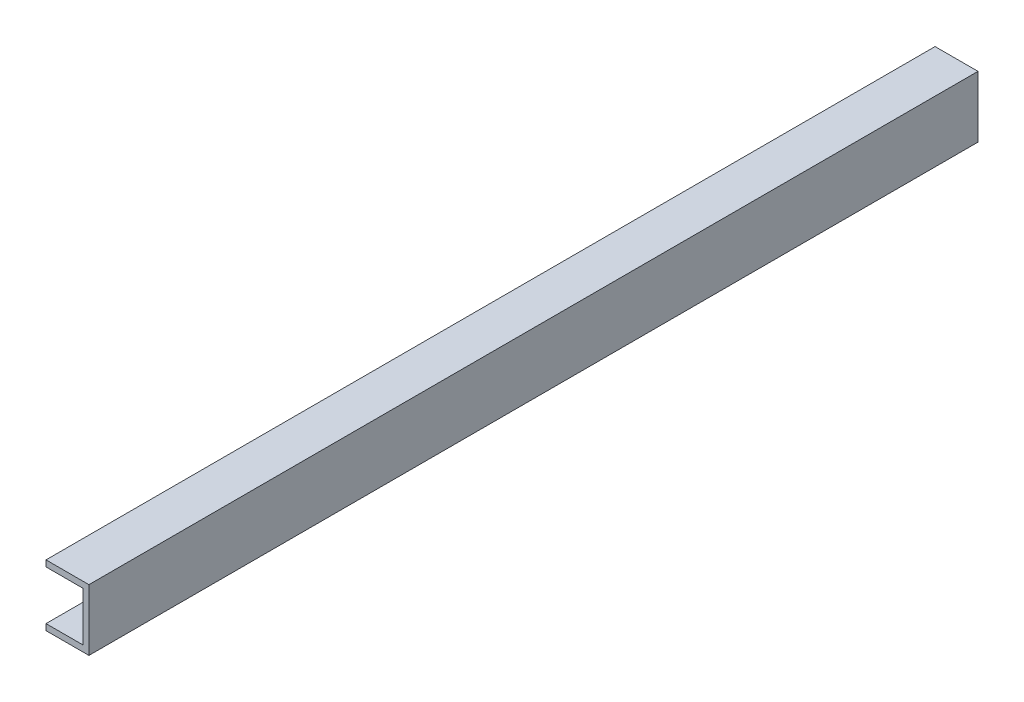
ISO-10303-21;
HEADER;
FILE_DESCRIPTION(('STEP AP214'),'2;1');
FILE_NAME('part.step','',(''),(''),'','','');
FILE_SCHEMA(('AUTOMOTIVE_DESIGN { 1 0 10303 214 1 1 1 1 }'));
ENDSEC;
DATA;
#1=APPLICATION_CONTEXT('core data for automotive mechanical design processes');
#2=APPLICATION_PROTOCOL_DEFINITION('international standard','automotive_design',2000,#1);
#3=PRODUCT_CONTEXT('',#1,'mechanical');
#4=PRODUCT('Part','Part','',(#3));
#5=PRODUCT_RELATED_PRODUCT_CATEGORY('part','',(#4));
#6=PRODUCT_DEFINITION_FORMATION('','',#4);
#7=PRODUCT_DEFINITION_CONTEXT('part definition',#1,'design');
#8=PRODUCT_DEFINITION('design','',#6,#7);
#9=PRODUCT_DEFINITION_SHAPE('','',#8);
#10=(LENGTH_UNIT() NAMED_UNIT(*) SI_UNIT(.MILLI.,.METRE.));
#11=(NAMED_UNIT(*) PLANE_ANGLE_UNIT() SI_UNIT($,.RADIAN.));
#12=(NAMED_UNIT(*) SI_UNIT($,.STERADIAN.) SOLID_ANGLE_UNIT());
#13=UNCERTAINTY_MEASURE_WITH_UNIT(LENGTH_MEASURE(1.E-05),#10,'distance_accuracy_value','');
#14=(GEOMETRIC_REPRESENTATION_CONTEXT(3) GLOBAL_UNCERTAINTY_ASSIGNED_CONTEXT((#13)) GLOBAL_UNIT_ASSIGNED_CONTEXT((#10,
#11,#12)) REPRESENTATION_CONTEXT('',''));
#15=CARTESIAN_POINT('',(0.,0.,0.));
#16=DIRECTION('',(0.,0.,1.));
#17=DIRECTION('',(1.,0.,0.));
#18=AXIS2_PLACEMENT_3D('',#15,#16,#17);
#19=CARTESIAN_POINT('',(0.,2.,290.));
#20=DIRECTION('',(1.,0.,0.));
#21=DIRECTION('',(0.,0.,-1.));
#22=AXIS2_PLACEMENT_3D('',#19,#20,#21);
#23=PLANE('',#22);
#24=DIRECTION('',(0.,-1.,0.));
#25=VECTOR('',#24,1.);
#26=CARTESIAN_POINT('',(0.,2.,0.));
#27=LINE('',#26,#25);
#28=CARTESIAN_POINT('',(0.,2.,0.));
#29=VERTEX_POINT('',#28);
#30=CARTESIAN_POINT('',(0.,0.,0.));
#31=VERTEX_POINT('',#30);
#32=EDGE_CURVE('E128',#29,#31,#27,.T.);
#33=ORIENTED_EDGE('',*,*,#32,.T.);
#34=DIRECTION('',(0.,0.,-1.));
#35=VECTOR('',#34,1.);
#36=CARTESIAN_POINT('',(0.,0.,290.));
#37=LINE('',#36,#35);
#38=CARTESIAN_POINT('',(0.,0.,290.));
#39=VERTEX_POINT('',#38);
#40=EDGE_CURVE('E11',#39,#31,#37,.T.);
#41=ORIENTED_EDGE('',*,*,#40,.F.);
#42=DIRECTION('',(0.,-1.,0.));
#43=VECTOR('',#42,1.);
#44=CARTESIAN_POINT('',(0.,2.,290.));
#45=LINE('',#44,#43);
#46=CARTESIAN_POINT('',(0.,2.,290.));
#47=VERTEX_POINT('',#46);
#48=EDGE_CURVE('E142',#47,#39,#45,.T.);
#49=ORIENTED_EDGE('',*,*,#48,.F.);
#50=DIRECTION('',(0.,0.,-1.));
#51=VECTOR('',#50,1.);
#52=CARTESIAN_POINT('',(0.,2.,290.));
#53=LINE('',#52,#51);
#54=EDGE_CURVE('E124',#47,#29,#53,.T.);
#55=ORIENTED_EDGE('',*,*,#54,.T.);
#56=EDGE_LOOP('',(#33,#41,#49,#55));
#57=FACE_BOUND('',#56,.T.);
#58=ADVANCED_FACE('F32',(#57),#23,.F.);
#59=CARTESIAN_POINT('',(0.,0.,290.));
#60=DIRECTION('',(0.,1.,0.));
#61=DIRECTION('',(0.,0.,1.));
#62=AXIS2_PLACEMENT_3D('',#59,#60,#61);
#63=PLANE('',#62);
#64=DIRECTION('',(1.,0.,0.));
#65=VECTOR('',#64,1.);
#66=CARTESIAN_POINT('',(0.,0.,0.));
#67=LINE('',#66,#65);
#68=CARTESIAN_POINT('',(14.,0.,0.));
#69=VERTEX_POINT('',#68);
#70=EDGE_CURVE('E131',#31,#69,#67,.T.);
#71=ORIENTED_EDGE('',*,*,#70,.T.);
#72=DIRECTION('',(0.,0.,-1.));
#73=VECTOR('',#72,1.);
#74=CARTESIAN_POINT('',(14.,0.,290.));
#75=LINE('',#74,#73);
#76=CARTESIAN_POINT('',(14.,0.,290.));
#77=VERTEX_POINT('',#76);
#78=EDGE_CURVE('E40',#77,#69,#75,.T.);
#79=ORIENTED_EDGE('',*,*,#78,.F.);
#80=DIRECTION('',(1.,0.,0.));
#81=VECTOR('',#80,1.);
#82=CARTESIAN_POINT('',(0.,0.,290.));
#83=LINE('',#82,#81);
#84=EDGE_CURVE('E91',#39,#77,#83,.T.);
#85=ORIENTED_EDGE('',*,*,#84,.F.);
#86=ORIENTED_EDGE('',*,*,#40,.T.);
#87=EDGE_LOOP('',(#71,#79,#85,#86));
#88=FACE_BOUND('',#87,.T.);
#89=ADVANCED_FACE('F177',(#88),#63,.F.);
#90=CARTESIAN_POINT('',(14.,0.,290.));
#91=DIRECTION('',(-1.,0.,0.));
#92=DIRECTION('',(0.,0.,1.));
#93=AXIS2_PLACEMENT_3D('',#90,#91,#92);
#94=PLANE('',#93);
#95=DIRECTION('',(0.,1.,0.));
#96=VECTOR('',#95,1.);
#97=CARTESIAN_POINT('',(14.,0.,0.));
#98=LINE('',#97,#96);
#99=CARTESIAN_POINT('',(14.,20.,0.));
#100=VERTEX_POINT('',#99);
#101=EDGE_CURVE('E133',#69,#100,#98,.T.);
#102=ORIENTED_EDGE('',*,*,#101,.T.);
#103=DIRECTION('',(0.,0.,-1.));
#104=VECTOR('',#103,1.);
#105=CARTESIAN_POINT('',(14.,20.,290.));
#106=LINE('',#105,#104);
#107=CARTESIAN_POINT('',(14.,20.,290.));
#108=VERTEX_POINT('',#107);
#109=EDGE_CURVE('E149',#108,#100,#106,.T.);
#110=ORIENTED_EDGE('',*,*,#109,.F.);
#111=DIRECTION('',(0.,1.,0.));
#112=VECTOR('',#111,1.);
#113=CARTESIAN_POINT('',(14.,0.,290.));
#114=LINE('',#113,#112);
#115=EDGE_CURVE('E157',#77,#108,#114,.T.);
#116=ORIENTED_EDGE('',*,*,#115,.F.);
#117=ORIENTED_EDGE('',*,*,#78,.T.);
#118=EDGE_LOOP('',(#102,#110,#116,#117));
#119=FACE_BOUND('',#118,.T.);
#120=ADVANCED_FACE('F155',(#119),#94,.F.);
#121=CARTESIAN_POINT('',(14.,20.,290.));
#122=DIRECTION('',(0.,-1.,0.));
#123=DIRECTION('',(0.,0.,-1.));
#124=AXIS2_PLACEMENT_3D('',#121,#122,#123);
#125=PLANE('',#124);
#126=DIRECTION('',(-1.,0.,0.));
#127=VECTOR('',#126,1.);
#128=CARTESIAN_POINT('',(14.,20.,0.));
#129=LINE('',#128,#127);
#130=CARTESIAN_POINT('',(0.,20.,0.));
#131=VERTEX_POINT('',#130);
#132=EDGE_CURVE('E135',#100,#131,#129,.T.);
#133=ORIENTED_EDGE('',*,*,#132,.T.);
#134=DIRECTION('',(0.,0.,-1.));
#135=VECTOR('',#134,1.);
#136=CARTESIAN_POINT('',(0.,20.,290.));
#137=LINE('',#136,#135);
#138=CARTESIAN_POINT('',(0.,20.,290.));
#139=VERTEX_POINT('',#138);
#140=EDGE_CURVE('E146',#139,#131,#137,.T.);
#141=ORIENTED_EDGE('',*,*,#140,.F.);
#142=DIRECTION('',(-1.,0.,0.));
#143=VECTOR('',#142,1.);
#144=CARTESIAN_POINT('',(14.,20.,290.));
#145=LINE('',#144,#143);
#146=EDGE_CURVE('E169',#108,#139,#145,.T.);
#147=ORIENTED_EDGE('',*,*,#146,.F.);
#148=ORIENTED_EDGE('',*,*,#109,.T.);
#149=EDGE_LOOP('',(#133,#141,#147,#148));
#150=FACE_BOUND('',#149,.T.);
#151=ADVANCED_FACE('F165',(#150),#125,.F.);
#152=CARTESIAN_POINT('',(0.,20.,290.));
#153=DIRECTION('',(1.,0.,0.));
#154=DIRECTION('',(0.,1.,0.));
#155=AXIS2_PLACEMENT_3D('',#152,#153,#154);
#156=PLANE('',#155);
#157=DIRECTION('',(0.,-1.,0.));
#158=VECTOR('',#157,1.);
#159=CARTESIAN_POINT('',(0.,20.,0.));
#160=LINE('',#159,#158);
#161=CARTESIAN_POINT('',(0.,18.,0.));
#162=VERTEX_POINT('',#161);
#163=EDGE_CURVE('E137',#131,#162,#160,.T.);
#164=ORIENTED_EDGE('',*,*,#163,.T.);
#165=DIRECTION('',(0.,0.,-1.));
#166=VECTOR('',#165,1.);
#167=CARTESIAN_POINT('',(0.,18.,290.));
#168=LINE('',#167,#166);
#169=CARTESIAN_POINT('',(0.,18.,290.));
#170=VERTEX_POINT('',#169);
#171=EDGE_CURVE('E119',#170,#162,#168,.T.);
#172=ORIENTED_EDGE('',*,*,#171,.F.);
#173=DIRECTION('',(0.,-1.,0.));
#174=VECTOR('',#173,1.);
#175=CARTESIAN_POINT('',(0.,20.,290.));
#176=LINE('',#175,#174);
#177=EDGE_CURVE('E110',#139,#170,#176,.T.);
#178=ORIENTED_EDGE('',*,*,#177,.F.);
#179=ORIENTED_EDGE('',*,*,#140,.T.);
#180=EDGE_LOOP('',(#164,#172,#178,#179));
#181=FACE_BOUND('',#180,.T.);
#182=ADVANCED_FACE('F168',(#181),#156,.F.);
#183=CARTESIAN_POINT('',(0.,18.,290.));
#184=DIRECTION('',(0.,1.,0.));
#185=DIRECTION('',(0.,0.,1.));
#186=AXIS2_PLACEMENT_3D('',#183,#184,#185);
#187=PLANE('',#186);
#188=DIRECTION('',(1.,0.,0.));
#189=VECTOR('',#188,1.);
#190=CARTESIAN_POINT('',(0.,18.,0.));
#191=LINE('',#190,#189);
#192=CARTESIAN_POINT('',(12.,18.,0.));
#193=VERTEX_POINT('',#192);
#194=EDGE_CURVE('E118',#162,#193,#191,.T.);
#195=ORIENTED_EDGE('',*,*,#194,.T.);
#196=DIRECTION('',(0.,0.,-1.));
#197=VECTOR('',#196,1.);
#198=CARTESIAN_POINT('',(12.,18.,290.));
#199=LINE('',#198,#197);
#200=CARTESIAN_POINT('',(12.,18.,290.));
#201=VERTEX_POINT('',#200);
#202=EDGE_CURVE('E115',#201,#193,#199,.T.);
#203=ORIENTED_EDGE('',*,*,#202,.F.);
#204=DIRECTION('',(1.,0.,0.));
#205=VECTOR('',#204,1.);
#206=CARTESIAN_POINT('',(0.,18.,290.));
#207=LINE('',#206,#205);
#208=EDGE_CURVE('E104',#170,#201,#207,.T.);
#209=ORIENTED_EDGE('',*,*,#208,.F.);
#210=ORIENTED_EDGE('',*,*,#171,.T.);
#211=EDGE_LOOP('',(#195,#203,#209,#210));
#212=FACE_BOUND('',#211,.T.);
#213=ADVANCED_FACE('F116',(#212),#187,.F.);
#214=CARTESIAN_POINT('',(12.,18.,290.));
#215=DIRECTION('',(1.,0.,0.));
#216=DIRECTION('',(0.,1.,0.));
#217=AXIS2_PLACEMENT_3D('',#214,#215,#216);
#218=PLANE('',#217);
#219=DIRECTION('',(0.,-1.,0.));
#220=VECTOR('',#219,1.);
#221=CARTESIAN_POINT('',(12.,18.,0.));
#222=LINE('',#221,#220);
#223=CARTESIAN_POINT('',(12.,2.,0.));
#224=VERTEX_POINT('',#223);
#225=EDGE_CURVE('E77',#193,#224,#222,.T.);
#226=ORIENTED_EDGE('',*,*,#225,.T.);
#227=DIRECTION('',(0.,0.,-1.));
#228=VECTOR('',#227,1.);
#229=CARTESIAN_POINT('',(12.,2.,290.));
#230=LINE('',#229,#228);
#231=CARTESIAN_POINT('',(12.,2.,290.));
#232=VERTEX_POINT('',#231);
#233=EDGE_CURVE('E120',#232,#224,#230,.T.);
#234=ORIENTED_EDGE('',*,*,#233,.F.);
#235=DIRECTION('',(0.,-1.,0.));
#236=VECTOR('',#235,1.);
#237=CARTESIAN_POINT('',(12.,18.,290.));
#238=LINE('',#237,#236);
#239=EDGE_CURVE('E108',#201,#232,#238,.T.);
#240=ORIENTED_EDGE('',*,*,#239,.F.);
#241=ORIENTED_EDGE('',*,*,#202,.T.);
#242=EDGE_LOOP('',(#226,#234,#240,#241));
#243=FACE_BOUND('',#242,.T.);
#244=ADVANCED_FACE('F122',(#243),#218,.F.);
#245=CARTESIAN_POINT('',(12.,2.,290.));
#246=DIRECTION('',(0.,-1.,0.));
#247=DIRECTION('',(0.,0.,-1.));
#248=AXIS2_PLACEMENT_3D('',#245,#246,#247);
#249=PLANE('',#248);
#250=DIRECTION('',(-1.,0.,0.));
#251=VECTOR('',#250,1.);
#252=CARTESIAN_POINT('',(12.,2.,0.));
#253=LINE('',#252,#251);
#254=EDGE_CURVE('E83',#224,#29,#253,.T.);
#255=ORIENTED_EDGE('',*,*,#254,.T.);
#256=ORIENTED_EDGE('',*,*,#54,.F.);
#257=DIRECTION('',(-1.,0.,0.));
#258=VECTOR('',#257,1.);
#259=CARTESIAN_POINT('',(12.,2.,290.));
#260=LINE('',#259,#258);
#261=EDGE_CURVE('E48',#232,#47,#260,.T.);
#262=ORIENTED_EDGE('',*,*,#261,.F.);
#263=ORIENTED_EDGE('',*,*,#233,.T.);
#264=EDGE_LOOP('',(#255,#256,#262,#263));
#265=FACE_BOUND('',#264,.T.);
#266=ADVANCED_FACE('F193',(#265),#249,.F.);
#267=CARTESIAN_POINT('',(0.,0.,290.));
#268=DIRECTION('',(0.,0.,1.));
#269=DIRECTION('',(1.,0.,0.));
#270=AXIS2_PLACEMENT_3D('',#267,#268,#269);
#271=PLANE('',#270);
#272=ORIENTED_EDGE('',*,*,#48,.T.);
#273=ORIENTED_EDGE('',*,*,#84,.T.);
#274=ORIENTED_EDGE('',*,*,#115,.T.);
#275=ORIENTED_EDGE('',*,*,#146,.T.);
#276=ORIENTED_EDGE('',*,*,#177,.T.);
#277=ORIENTED_EDGE('',*,*,#208,.T.);
#278=ORIENTED_EDGE('',*,*,#239,.T.);
#279=ORIENTED_EDGE('',*,*,#261,.T.);
#280=EDGE_LOOP('',(#272,#273,#274,#275,#276,#277,#278,#279));
#281=FACE_BOUND('',#280,.T.);
#282=ADVANCED_FACE('F106',(#281),#271,.T.);
#283=CARTESIAN_POINT('',(0.,0.,0.));
#284=DIRECTION('',(0.,0.,1.));
#285=DIRECTION('',(1.,0.,0.));
#286=AXIS2_PLACEMENT_3D('',#283,#284,#285);
#287=PLANE('',#286);
#288=ORIENTED_EDGE('',*,*,#32,.F.);
#289=ORIENTED_EDGE('',*,*,#254,.F.);
#290=ORIENTED_EDGE('',*,*,#225,.F.);
#291=ORIENTED_EDGE('',*,*,#194,.F.);
#292=ORIENTED_EDGE('',*,*,#163,.F.);
#293=ORIENTED_EDGE('',*,*,#132,.F.);
#294=ORIENTED_EDGE('',*,*,#101,.F.);
#295=ORIENTED_EDGE('',*,*,#70,.F.);
#296=EDGE_LOOP('',(#288,#289,#290,#291,#292,#293,#294,#295));
#297=FACE_BOUND('',#296,.T.);
#298=ADVANCED_FACE('F161',(#297),#287,.F.);
#299=CLOSED_SHELL('',(#58,#89,#120,#151,#182,#213,#244,#266,#282,#298));
#300=MANIFOLD_SOLID_BREP('B2',#299);
#301=ADVANCED_BREP_SHAPE_REPRESENTATION('',(#18,#300),#14);
#302=SHAPE_DEFINITION_REPRESENTATION(#9,#301);
ENDSEC;
END-ISO-10303-21;
